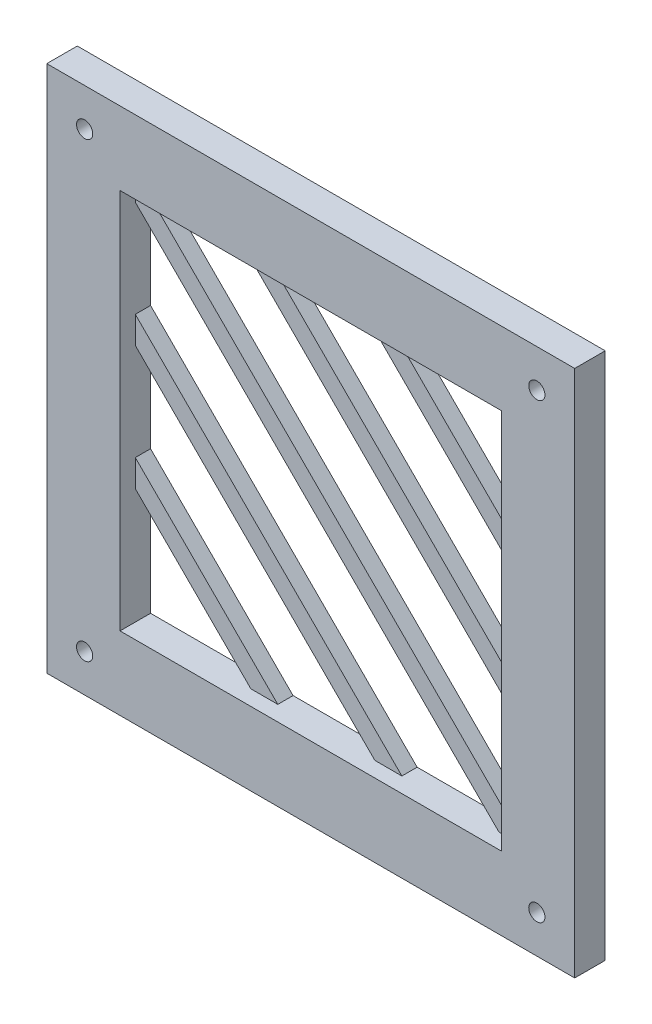
ISO-10303-21;
HEADER;
FILE_DESCRIPTION(('STEP AP214'),'2;1');
FILE_NAME('part.step','',(''),(''),'','','');
FILE_SCHEMA(('AUTOMOTIVE_DESIGN { 1 0 10303 214 1 1 1 1 }'));
ENDSEC;
DATA;
#1=APPLICATION_CONTEXT('core data for automotive mechanical design processes');
#2=APPLICATION_PROTOCOL_DEFINITION('international standard','automotive_design',2000,#1);
#3=PRODUCT_CONTEXT('',#1,'mechanical');
#4=PRODUCT('Part','Part','',(#3));
#5=PRODUCT_RELATED_PRODUCT_CATEGORY('part','',(#4));
#6=PRODUCT_DEFINITION_FORMATION('','',#4);
#7=PRODUCT_DEFINITION_CONTEXT('part definition',#1,'design');
#8=PRODUCT_DEFINITION('design','',#6,#7);
#9=PRODUCT_DEFINITION_SHAPE('','',#8);
#10=(LENGTH_UNIT() NAMED_UNIT(*) SI_UNIT(.MILLI.,.METRE.));
#11=(NAMED_UNIT(*) PLANE_ANGLE_UNIT() SI_UNIT($,.RADIAN.));
#12=(NAMED_UNIT(*) SI_UNIT($,.STERADIAN.) SOLID_ANGLE_UNIT());
#13=UNCERTAINTY_MEASURE_WITH_UNIT(LENGTH_MEASURE(1.E-05),#10,'distance_accuracy_value','');
#14=(GEOMETRIC_REPRESENTATION_CONTEXT(3) GLOBAL_UNCERTAINTY_ASSIGNED_CONTEXT((#13)) GLOBAL_UNIT_ASSIGNED_CONTEXT((#10,
#11,#12)) REPRESENTATION_CONTEXT('',''));
#15=CARTESIAN_POINT('',(0.,0.,0.));
#16=DIRECTION('',(0.,0.,1.));
#17=DIRECTION('',(1.,0.,0.));
#18=AXIS2_PLACEMENT_3D('',#15,#16,#17);
#19=CARTESIAN_POINT('',(0.,0.,8.));
#20=DIRECTION('',(0.,0.,-1.));
#21=DIRECTION('',(-1.,0.,0.));
#22=AXIS2_PLACEMENT_3D('',#19,#20,#21);
#23=PLANE('',#22);
#24=DIRECTION('',(0.,1.,0.));
#25=VECTOR('',#24,1.);
#26=CARTESIAN_POINT('',(50.,-50.,8.));
#27=LINE('',#26,#25);
#28=CARTESIAN_POINT('',(50.,-50.,8.));
#29=VERTEX_POINT('',#28);
#30=CARTESIAN_POINT('',(50.,50.,8.));
#31=VERTEX_POINT('',#30);
#32=EDGE_CURVE('E254',#29,#31,#27,.T.);
#33=ORIENTED_EDGE('',*,*,#32,.F.);
#34=DIRECTION('',(1.,0.,0.));
#35=VECTOR('',#34,1.);
#36=CARTESIAN_POINT('',(-50.,-50.,8.));
#37=LINE('',#36,#35);
#38=CARTESIAN_POINT('',(-50.,-50.,8.));
#39=VERTEX_POINT('',#38);
#40=EDGE_CURVE('E395',#39,#29,#37,.T.);
#41=ORIENTED_EDGE('',*,*,#40,.F.);
#42=DIRECTION('',(0.,-1.,0.));
#43=VECTOR('',#42,1.);
#44=CARTESIAN_POINT('',(-50.,-50.,8.));
#45=LINE('',#44,#43);
#46=CARTESIAN_POINT('',(-50.,50.,8.));
#47=VERTEX_POINT('',#46);
#48=EDGE_CURVE('E391',#47,#39,#45,.T.);
#49=ORIENTED_EDGE('',*,*,#48,.F.);
#50=DIRECTION('',(-1.,0.,0.));
#51=VECTOR('',#50,1.);
#52=CARTESIAN_POINT('',(-50.,50.,8.));
#53=LINE('',#52,#51);
#54=EDGE_CURVE('E388',#31,#47,#53,.T.);
#55=ORIENTED_EDGE('',*,*,#54,.F.);
#56=EDGE_LOOP('',(#33,#41,#49,#55));
#57=FACE_BOUND('',#56,.T.);
#58=DIRECTION('',(0.,1.,0.));
#59=VECTOR('',#58,1.);
#60=CARTESIAN_POINT('',(69.21,-69.21,8.));
#61=LINE('',#60,#59);
#62=CARTESIAN_POINT('',(69.21,-69.21,8.));
#63=VERTEX_POINT('',#62);
#64=CARTESIAN_POINT('',(69.21,69.21,8.));
#65=VERTEX_POINT('',#64);
#66=EDGE_CURVE('E434',#63,#65,#61,.T.);
#67=ORIENTED_EDGE('',*,*,#66,.T.);
#68=DIRECTION('',(-1.,0.,0.));
#69=VECTOR('',#68,1.);
#70=CARTESIAN_POINT('',(-69.21,69.21,8.));
#71=LINE('',#70,#69);
#72=CARTESIAN_POINT('',(-69.21,69.21,8.));
#73=VERTEX_POINT('',#72);
#74=EDGE_CURVE('E438',#65,#73,#71,.T.);
#75=ORIENTED_EDGE('',*,*,#74,.T.);
#76=DIRECTION('',(0.,-1.,0.));
#77=VECTOR('',#76,1.);
#78=CARTESIAN_POINT('',(-69.21,-69.21,8.));
#79=LINE('',#78,#77);
#80=CARTESIAN_POINT('',(-69.21,-69.21,8.));
#81=VERTEX_POINT('',#80);
#82=EDGE_CURVE('E442',#73,#81,#79,.T.);
#83=ORIENTED_EDGE('',*,*,#82,.T.);
#84=DIRECTION('',(1.,0.,0.));
#85=VECTOR('',#84,1.);
#86=CARTESIAN_POINT('',(-69.21,-69.21,8.));
#87=LINE('',#86,#85);
#88=EDGE_CURVE('E445',#81,#63,#87,.T.);
#89=ORIENTED_EDGE('',*,*,#88,.T.);
#90=EDGE_LOOP('',(#67,#75,#83,#89));
#91=FACE_BOUND('',#90,.T.);
#92=CARTESIAN_POINT('',(-59.285,59.285,8.));
#93=DIRECTION('',(0.,0.,1.));
#94=DIRECTION('',(1.,0.,0.));
#95=AXIS2_PLACEMENT_3D('',#92,#93,#94);
#96=CIRCLE('',#95,2.125);
#97=CARTESIAN_POINT('',(-57.16,59.285,8.));
#98=VERTEX_POINT('',#97);
#99=EDGE_CURVE('E426',#98,#98,#96,.T.);
#100=ORIENTED_EDGE('',*,*,#99,.F.);
#101=EDGE_LOOP('',(#100));
#102=FACE_BOUND('',#101,.T.);
#103=CARTESIAN_POINT('',(59.285,-59.285,8.));
#104=DIRECTION('',(0.,0.,1.));
#105=DIRECTION('',(-1.,0.,0.));
#106=AXIS2_PLACEMENT_3D('',#103,#104,#105);
#107=CIRCLE('',#106,2.12500000000002);
#108=CARTESIAN_POINT('',(57.1599999999999,-59.285,8.));
#109=VERTEX_POINT('',#108);
#110=EDGE_CURVE('E418',#109,#109,#107,.T.);
#111=ORIENTED_EDGE('',*,*,#110,.F.);
#112=EDGE_LOOP('',(#111));
#113=FACE_BOUND('',#112,.T.);
#114=CARTESIAN_POINT('',(59.285,59.285,8.));
#115=DIRECTION('',(0.,0.,1.));
#116=DIRECTION('',(1.,0.,0.));
#117=AXIS2_PLACEMENT_3D('',#114,#115,#116);
#118=CIRCLE('',#117,2.12500000000002);
#119=CARTESIAN_POINT('',(61.41,59.285,8.));
#120=VERTEX_POINT('',#119);
#121=EDGE_CURVE('E410',#120,#120,#118,.T.);
#122=ORIENTED_EDGE('',*,*,#121,.F.);
#123=EDGE_LOOP('',(#122));
#124=FACE_BOUND('',#123,.T.);
#125=CARTESIAN_POINT('',(-59.285,-59.285,8.));
#126=DIRECTION('',(0.,0.,1.));
#127=DIRECTION('',(-1.,0.,0.));
#128=AXIS2_PLACEMENT_3D('',#125,#126,#127);
#129=CIRCLE('',#128,2.125);
#130=CARTESIAN_POINT('',(-61.41,-59.285,8.));
#131=VERTEX_POINT('',#130);
#132=EDGE_CURVE('E402',#131,#131,#129,.T.);
#133=ORIENTED_EDGE('',*,*,#132,.F.);
#134=EDGE_LOOP('',(#133));
#135=FACE_BOUND('',#134,.T.);
#136=ADVANCED_FACE('F45',(#57,#91,#102,#113,#124,#135),#23,.F.);
#137=CARTESIAN_POINT('',(0.,0.,0.));
#138=DIRECTION('',(0.,0.,-1.));
#139=DIRECTION('',(-1.,0.,0.));
#140=AXIS2_PLACEMENT_3D('',#137,#138,#139);
#141=PLANE('',#140);
#142=DIRECTION('',(0.,-1.,0.));
#143=VECTOR('',#142,1.);
#144=CARTESIAN_POINT('',(-50.,-50.,0.));
#145=LINE('',#144,#143);
#146=CARTESIAN_POINT('',(-50.,12.8212844498098,0.));
#147=VERTEX_POINT('',#146);
#148=CARTESIAN_POINT('',(-50.,-12.6345596729059,0.));
#149=VERTEX_POINT('',#148);
#150=EDGE_CURVE('E379',#147,#149,#145,.T.);
#151=ORIENTED_EDGE('',*,*,#150,.T.);
#152=DIRECTION('',(0.707106781186547,-0.707106781186548,0.));
#153=VECTOR('',#152,1.);
#154=CARTESIAN_POINT('',(-100.528694050015,37.8941343771094,0.));
#155=LINE('',#154,#153);
#156=CARTESIAN_POINT('',(-12.6345596729059,-50.,0.));
#157=VERTEX_POINT('',#156);
#158=EDGE_CURVE('E825',#149,#157,#155,.T.);
#159=ORIENTED_EDGE('',*,*,#158,.T.);
#160=DIRECTION('',(1.,0.,0.));
#161=VECTOR('',#160,1.);
#162=CARTESIAN_POINT('',(-50.,-50.,0.));
#163=LINE('',#162,#161);
#164=CARTESIAN_POINT('',(12.8212844498098,-50.,0.));
#165=VERTEX_POINT('',#164);
#166=EDGE_CURVE('E385',#157,#165,#163,.T.);
#167=ORIENTED_EDGE('',*,*,#166,.T.);
#168=DIRECTION('',(0.707106781186547,-0.707106781186548,0.));
#169=VECTOR('',#168,1.);
#170=CARTESIAN_POINT('',(-87.8007719886575,50.6220564384672,0.));
#171=LINE('',#170,#169);
#172=EDGE_CURVE('E849',#147,#165,#171,.T.);
#173=ORIENTED_EDGE('',*,*,#172,.F.);
#174=EDGE_LOOP('',(#151,#159,#167,#173));
#175=FACE_BOUND('',#174,.T.);
#176=DIRECTION('',(0.707106781186547,-0.707106781186548,0.));
#177=VECTOR('',#176,1.);
#178=CARTESIAN_POINT('',(-84.2652380827247,54.1575903444,0.));
#179=LINE('',#178,#177);
#180=CARTESIAN_POINT('',(-50.,19.8923522616752,0.));
#181=VERTEX_POINT('',#180);
#182=CARTESIAN_POINT('',(19.8923522616752,-50.,0.));
#183=VERTEX_POINT('',#182);
#184=EDGE_CURVE('E846',#181,#183,#179,.T.);
#185=ORIENTED_EDGE('',*,*,#184,.T.);
#186=CARTESIAN_POINT('',(45.3481963843909,-50.,0.));
#187=VERTEX_POINT('',#186);
#188=EDGE_CURVE('E378',#183,#187,#163,.T.);
#189=ORIENTED_EDGE('',*,*,#188,.T.);
#190=DIRECTION('',(0.707106781186547,-0.707106781186548,0.));
#191=VECTOR('',#190,1.);
#192=CARTESIAN_POINT('',(-71.5373160213669,66.8855124057578,0.));
#193=LINE('',#192,#191);
#194=CARTESIAN_POINT('',(-50.,45.3481963843909,0.));
#195=VERTEX_POINT('',#194);
#196=EDGE_CURVE('E321',#195,#187,#193,.T.);
#197=ORIENTED_EDGE('',*,*,#196,.F.);
#198=EDGE_CURVE('E374',#195,#181,#145,.T.);
#199=ORIENTED_EDGE('',*,*,#198,.T.);
#200=EDGE_LOOP('',(#185,#189,#197,#199));
#201=FACE_BOUND('',#200,.T.);
#202=DIRECTION('',(-1.,0.,0.));
#203=VECTOR('',#202,1.);
#204=CARTESIAN_POINT('',(-50.,50.,0.));
#205=LINE('',#204,#203);
#206=CARTESIAN_POINT('',(-22.1248916810279,50.,0.));
#207=VERTEX_POINT('',#206);
#208=CARTESIAN_POINT('',(-47.5807358037436,50.,0.));
#209=VERTEX_POINT('',#208);
#210=EDGE_CURVE('E366',#207,#209,#205,.T.);
#211=ORIENTED_EDGE('',*,*,#210,.T.);
#212=DIRECTION('',(0.707106781186547,-0.707106781186548,0.));
#213=VECTOR('',#212,1.);
#214=CARTESIAN_POINT('',(-68.0017821154341,70.4210463116906,0.));
#215=LINE('',#214,#213);
#216=CARTESIAN_POINT('',(50.,-47.5807358037436,0.));
#217=VERTEX_POINT('',#216);
#218=EDGE_CURVE('E318',#209,#217,#215,.T.);
#219=ORIENTED_EDGE('',*,*,#218,.T.);
#220=DIRECTION('',(0.,1.,0.));
#221=VECTOR('',#220,1.);
#222=CARTESIAN_POINT('',(50.,-50.,0.));
#223=LINE('',#222,#221);
#224=CARTESIAN_POINT('',(50.,-22.1248916810279,0.));
#225=VERTEX_POINT('',#224);
#226=EDGE_CURVE('E362',#217,#225,#223,.T.);
#227=ORIENTED_EDGE('',*,*,#226,.T.);
#228=DIRECTION('',(0.707106781186547,-0.707106781186547,0.));
#229=VECTOR('',#228,1.);
#230=CARTESIAN_POINT('',(-55.2738600540763,83.1489683730484,0.));
#231=LINE('',#230,#229);
#232=EDGE_CURVE('E316',#207,#225,#231,.T.);
#233=ORIENTED_EDGE('',*,*,#232,.F.);
#234=EDGE_LOOP('',(#211,#219,#227,#233));
#235=FACE_BOUND('',#234,.T.);
#236=CARTESIAN_POINT('',(10.4020202535533,50.,0.));
#237=VERTEX_POINT('',#236);
#238=CARTESIAN_POINT('',(-15.0538238691624,50.,0.));
#239=VERTEX_POINT('',#238);
#240=EDGE_CURVE('E373',#237,#239,#205,.T.);
#241=ORIENTED_EDGE('',*,*,#240,.T.);
#242=DIRECTION('',(0.707106781186547,-0.707106781186547,0.));
#243=VECTOR('',#242,1.);
#244=CARTESIAN_POINT('',(-51.7383261481435,86.6845022789812,0.));
#245=LINE('',#244,#243);
#246=CARTESIAN_POINT('',(50.,-15.0538238691624,0.));
#247=VERTEX_POINT('',#246);
#248=EDGE_CURVE('E311',#239,#247,#245,.T.);
#249=ORIENTED_EDGE('',*,*,#248,.T.);
#250=CARTESIAN_POINT('',(50.,10.4020202535533,0.));
#251=VERTEX_POINT('',#250);
#252=EDGE_CURVE('E309',#247,#251,#223,.T.);
#253=ORIENTED_EDGE('',*,*,#252,.T.);
#254=DIRECTION('',(0.707106781186547,-0.707106781186547,0.));
#255=VECTOR('',#254,1.);
#256=CARTESIAN_POINT('',(-39.0104040867857,99.412424340339,0.));
#257=LINE('',#256,#255);
#258=EDGE_CURVE('E339',#237,#251,#257,.T.);
#259=ORIENTED_EDGE('',*,*,#258,.F.);
#260=EDGE_LOOP('',(#241,#249,#253,#259));
#261=FACE_BOUND('',#260,.T.);
#262=DIRECTION('',(0.707106781186547,-0.707106781186547,0.));
#263=VECTOR('',#262,1.);
#264=CARTESIAN_POINT('',(-35.4748701808529,102.947958246272,0.));
#265=LINE('',#264,#263);
#266=CARTESIAN_POINT('',(17.4730880654188,50.,0.));
#267=VERTEX_POINT('',#266);
#268=CARTESIAN_POINT('',(50.,17.4730880654188,0.));
#269=VERTEX_POINT('',#268);
#270=EDGE_CURVE('E336',#267,#269,#265,.T.);
#271=ORIENTED_EDGE('',*,*,#270,.T.);
#272=CARTESIAN_POINT('',(50.,42.9289321881345,0.));
#273=VERTEX_POINT('',#272);
#274=EDGE_CURVE('E367',#269,#273,#223,.T.);
#275=ORIENTED_EDGE('',*,*,#274,.T.);
#276=DIRECTION('',(0.707106781186547,-0.707106781186547,0.));
#277=VECTOR('',#276,1.);
#278=CARTESIAN_POINT('',(-22.7469481194951,115.67588030763,0.));
#279=LINE('',#278,#277);
#280=CARTESIAN_POINT('',(42.9289321881345,50.,0.));
#281=VERTEX_POINT('',#280);
#282=EDGE_CURVE('E356',#281,#273,#279,.T.);
#283=ORIENTED_EDGE('',*,*,#282,.F.);
#284=EDGE_CURVE('E368',#281,#267,#205,.T.);
#285=ORIENTED_EDGE('',*,*,#284,.T.);
#286=EDGE_LOOP('',(#271,#275,#283,#285));
#287=FACE_BOUND('',#286,.T.);
#288=CARTESIAN_POINT('',(-50.,-50.,0.));
#289=VERTEX_POINT('',#288);
#290=CARTESIAN_POINT('',(-19.7056274847714,-50.,0.));
#291=VERTEX_POINT('',#290);
#292=EDGE_CURVE('E380',#289,#291,#163,.T.);
#293=ORIENTED_EDGE('',*,*,#292,.T.);
#294=DIRECTION('',(0.707106781186547,-0.707106781186548,0.));
#295=VECTOR('',#294,1.);
#296=CARTESIAN_POINT('',(-104.064227955948,34.3586004711767,0.));
#297=LINE('',#296,#295);
#298=CARTESIAN_POINT('',(-50.,-19.7056274847714,0.));
#299=VERTEX_POINT('',#298);
#300=EDGE_CURVE('E827',#299,#291,#297,.T.);
#301=ORIENTED_EDGE('',*,*,#300,.F.);
#302=EDGE_CURVE('E372',#299,#289,#145,.T.);
#303=ORIENTED_EDGE('',*,*,#302,.T.);
#304=EDGE_LOOP('',(#293,#301,#303));
#305=FACE_BOUND('',#304,.T.);
#306=CARTESIAN_POINT('',(59.285,59.285,0.));
#307=DIRECTION('',(0.,0.,1.));
#308=DIRECTION('',(1.,0.,0.));
#309=AXIS2_PLACEMENT_3D('',#306,#307,#308);
#310=CIRCLE('',#309,2.12500000000002);
#311=CARTESIAN_POINT('',(61.41,59.285,0.));
#312=VERTEX_POINT('',#311);
#313=EDGE_CURVE('E406',#312,#312,#310,.T.);
#314=ORIENTED_EDGE('',*,*,#313,.T.);
#315=EDGE_LOOP('',(#314));
#316=FACE_BOUND('',#315,.T.);
#317=CARTESIAN_POINT('',(-59.285,59.285,0.));
#318=DIRECTION('',(0.,0.,1.));
#319=DIRECTION('',(1.,0.,0.));
#320=AXIS2_PLACEMENT_3D('',#317,#318,#319);
#321=CIRCLE('',#320,2.125);
#322=CARTESIAN_POINT('',(-57.16,59.285,0.));
#323=VERTEX_POINT('',#322);
#324=EDGE_CURVE('E422',#323,#323,#321,.T.);
#325=ORIENTED_EDGE('',*,*,#324,.T.);
#326=EDGE_LOOP('',(#325));
#327=FACE_BOUND('',#326,.T.);
#328=DIRECTION('',(0.,1.,0.));
#329=VECTOR('',#328,1.);
#330=CARTESIAN_POINT('',(69.21,-69.21,0.));
#331=LINE('',#330,#329);
#332=CARTESIAN_POINT('',(69.21,-69.21,0.));
#333=VERTEX_POINT('',#332);
#334=CARTESIAN_POINT('',(69.21,69.21,0.));
#335=VERTEX_POINT('',#334);
#336=EDGE_CURVE('E430',#333,#335,#331,.T.);
#337=ORIENTED_EDGE('',*,*,#336,.F.);
#338=DIRECTION('',(1.,0.,0.));
#339=VECTOR('',#338,1.);
#340=CARTESIAN_POINT('',(-69.21,-69.21,0.));
#341=LINE('',#340,#339);
#342=CARTESIAN_POINT('',(-69.21,-69.21,0.));
#343=VERTEX_POINT('',#342);
#344=EDGE_CURVE('E439',#343,#333,#341,.T.);
#345=ORIENTED_EDGE('',*,*,#344,.F.);
#346=DIRECTION('',(0.,-1.,0.));
#347=VECTOR('',#346,1.);
#348=CARTESIAN_POINT('',(-69.21,-69.21,0.));
#349=LINE('',#348,#347);
#350=CARTESIAN_POINT('',(-69.21,69.21,0.));
#351=VERTEX_POINT('',#350);
#352=EDGE_CURVE('E455',#351,#343,#349,.T.);
#353=ORIENTED_EDGE('',*,*,#352,.F.);
#354=DIRECTION('',(-1.,0.,0.));
#355=VECTOR('',#354,1.);
#356=CARTESIAN_POINT('',(-69.21,69.21,0.));
#357=LINE('',#356,#355);
#358=EDGE_CURVE('E452',#335,#351,#357,.T.);
#359=ORIENTED_EDGE('',*,*,#358,.F.);
#360=EDGE_LOOP('',(#337,#345,#353,#359));
#361=FACE_BOUND('',#360,.T.);
#362=CARTESIAN_POINT('',(59.285,-59.285,0.));
#363=DIRECTION('',(0.,0.,1.));
#364=DIRECTION('',(-1.,0.,0.));
#365=AXIS2_PLACEMENT_3D('',#362,#363,#364);
#366=CIRCLE('',#365,2.12500000000002);
#367=CARTESIAN_POINT('',(57.1599999999999,-59.285,0.));
#368=VERTEX_POINT('',#367);
#369=EDGE_CURVE('E414',#368,#368,#366,.T.);
#370=ORIENTED_EDGE('',*,*,#369,.T.);
#371=EDGE_LOOP('',(#370));
#372=FACE_BOUND('',#371,.T.);
#373=CARTESIAN_POINT('',(-59.285,-59.285,0.));
#374=DIRECTION('',(0.,0.,1.));
#375=DIRECTION('',(-1.,0.,0.));
#376=AXIS2_PLACEMENT_3D('',#373,#374,#375);
#377=CIRCLE('',#376,2.125);
#378=CARTESIAN_POINT('',(-61.41,-59.285,0.));
#379=VERTEX_POINT('',#378);
#380=EDGE_CURVE('E401',#379,#379,#377,.T.);
#381=ORIENTED_EDGE('',*,*,#380,.T.);
#382=EDGE_LOOP('',(#381));
#383=FACE_BOUND('',#382,.T.);
#384=ADVANCED_FACE('F482',(#175,#201,#235,#261,#287,#305,#316,#327,#361,#372,#383),#141,.T.);
#385=CARTESIAN_POINT('',(69.21,-69.21,8.));
#386=DIRECTION('',(-1.,0.,0.));
#387=DIRECTION('',(0.,0.,1.));
#388=AXIS2_PLACEMENT_3D('',#385,#386,#387);
#389=PLANE('',#388);
#390=ORIENTED_EDGE('',*,*,#336,.T.);
#391=DIRECTION('',(0.,0.,-1.));
#392=VECTOR('',#391,1.);
#393=CARTESIAN_POINT('',(69.21,69.21,8.));
#394=LINE('',#393,#392);
#395=EDGE_CURVE('E54',#65,#335,#394,.T.);
#396=ORIENTED_EDGE('',*,*,#395,.F.);
#397=ORIENTED_EDGE('',*,*,#66,.F.);
#398=DIRECTION('',(0.,0.,-1.));
#399=VECTOR('',#398,1.);
#400=CARTESIAN_POINT('',(69.21,-69.21,8.));
#401=LINE('',#400,#399);
#402=EDGE_CURVE('E448',#63,#333,#401,.T.);
#403=ORIENTED_EDGE('',*,*,#402,.T.);
#404=EDGE_LOOP('',(#390,#396,#397,#403));
#405=FACE_BOUND('',#404,.T.);
#406=ADVANCED_FACE('F47',(#405),#389,.F.);
#407=CARTESIAN_POINT('',(-69.21,69.21,8.));
#408=DIRECTION('',(0.,-1.,0.));
#409=DIRECTION('',(0.,0.,-1.));
#410=AXIS2_PLACEMENT_3D('',#407,#408,#409);
#411=PLANE('',#410);
#412=ORIENTED_EDGE('',*,*,#358,.T.);
#413=DIRECTION('',(0.,0.,-1.));
#414=VECTOR('',#413,1.);
#415=CARTESIAN_POINT('',(-69.21,69.21,8.));
#416=LINE('',#415,#414);
#417=EDGE_CURVE('E467',#73,#351,#416,.T.);
#418=ORIENTED_EDGE('',*,*,#417,.F.);
#419=ORIENTED_EDGE('',*,*,#74,.F.);
#420=ORIENTED_EDGE('',*,*,#395,.T.);
#421=EDGE_LOOP('',(#412,#418,#419,#420));
#422=FACE_BOUND('',#421,.T.);
#423=ADVANCED_FACE('F474',(#422),#411,.F.);
#424=CARTESIAN_POINT('',(-69.21,-69.21,8.));
#425=DIRECTION('',(1.,0.,0.));
#426=DIRECTION('',(0.,0.,-1.));
#427=AXIS2_PLACEMENT_3D('',#424,#425,#426);
#428=PLANE('',#427);
#429=ORIENTED_EDGE('',*,*,#352,.T.);
#430=DIRECTION('',(0.,0.,-1.));
#431=VECTOR('',#430,1.);
#432=CARTESIAN_POINT('',(-69.21,-69.21,8.));
#433=LINE('',#432,#431);
#434=EDGE_CURVE('E463',#81,#343,#433,.T.);
#435=ORIENTED_EDGE('',*,*,#434,.F.);
#436=ORIENTED_EDGE('',*,*,#82,.F.);
#437=ORIENTED_EDGE('',*,*,#417,.T.);
#438=EDGE_LOOP('',(#429,#435,#436,#437));
#439=FACE_BOUND('',#438,.T.);
#440=ADVANCED_FACE('F487',(#439),#428,.F.);
#441=CARTESIAN_POINT('',(-69.21,-69.21,8.));
#442=DIRECTION('',(0.,1.,0.));
#443=DIRECTION('',(0.,0.,1.));
#444=AXIS2_PLACEMENT_3D('',#441,#442,#443);
#445=PLANE('',#444);
#446=ORIENTED_EDGE('',*,*,#344,.T.);
#447=ORIENTED_EDGE('',*,*,#402,.F.);
#448=ORIENTED_EDGE('',*,*,#88,.F.);
#449=ORIENTED_EDGE('',*,*,#434,.T.);
#450=EDGE_LOOP('',(#446,#447,#448,#449));
#451=FACE_BOUND('',#450,.T.);
#452=ADVANCED_FACE('F491',(#451),#445,.F.);
#453=CARTESIAN_POINT('',(-59.285,59.285,8.));
#454=DIRECTION('',(0.,0.,-1.));
#455=DIRECTION('',(-1.,0.,0.));
#456=AXIS2_PLACEMENT_3D('',#453,#454,#455);
#457=CYLINDRICAL_SURFACE('',#456,2.125);
#458=ORIENTED_EDGE('',*,*,#99,.T.);
#459=EDGE_LOOP('',(#458));
#460=FACE_BOUND('',#459,.T.);
#461=ORIENTED_EDGE('',*,*,#324,.F.);
#462=EDGE_LOOP('',(#461));
#463=FACE_BOUND('',#462,.T.);
#464=ADVANCED_FACE('F524',(#460,#463),#457,.F.);
#465=CARTESIAN_POINT('',(59.285,-59.285,8.));
#466=DIRECTION('',(0.,0.,-1.));
#467=DIRECTION('',(-1.,0.,0.));
#468=AXIS2_PLACEMENT_3D('',#465,#466,#467);
#469=CYLINDRICAL_SURFACE('',#468,2.12500000000002);
#470=ORIENTED_EDGE('',*,*,#110,.T.);
#471=EDGE_LOOP('',(#470));
#472=FACE_BOUND('',#471,.T.);
#473=ORIENTED_EDGE('',*,*,#369,.F.);
#474=EDGE_LOOP('',(#473));
#475=FACE_BOUND('',#474,.T.);
#476=ADVANCED_FACE('F548',(#472,#475),#469,.F.);
#477=CARTESIAN_POINT('',(59.285,59.285,8.));
#478=DIRECTION('',(0.,0.,-1.));
#479=DIRECTION('',(-1.,0.,0.));
#480=AXIS2_PLACEMENT_3D('',#477,#478,#479);
#481=CYLINDRICAL_SURFACE('',#480,2.12500000000002);
#482=ORIENTED_EDGE('',*,*,#121,.T.);
#483=EDGE_LOOP('',(#482));
#484=FACE_BOUND('',#483,.T.);
#485=ORIENTED_EDGE('',*,*,#313,.F.);
#486=EDGE_LOOP('',(#485));
#487=FACE_BOUND('',#486,.T.);
#488=ADVANCED_FACE('F508',(#484,#487),#481,.F.);
#489=CARTESIAN_POINT('',(-59.285,-59.285,8.));
#490=DIRECTION('',(0.,0.,-1.));
#491=DIRECTION('',(-1.,0.,0.));
#492=AXIS2_PLACEMENT_3D('',#489,#490,#491);
#493=CYLINDRICAL_SURFACE('',#492,2.125);
#494=ORIENTED_EDGE('',*,*,#132,.T.);
#495=EDGE_LOOP('',(#494));
#496=FACE_BOUND('',#495,.T.);
#497=ORIENTED_EDGE('',*,*,#380,.F.);
#498=EDGE_LOOP('',(#497));
#499=FACE_BOUND('',#498,.T.);
#500=ADVANCED_FACE('F505',(#496,#499),#493,.F.);
#501=CARTESIAN_POINT('',(50.,-50.,0.));
#502=DIRECTION('',(1.,0.,0.));
#503=DIRECTION('',(0.,0.,-1.));
#504=AXIS2_PLACEMENT_3D('',#501,#502,#503);
#505=PLANE('',#504);
#506=DIRECTION('',(0.,0.,1.));
#507=VECTOR('',#506,1.);
#508=CARTESIAN_POINT('',(50.,17.4730880654188,8.00000000000003));
#509=LINE('',#508,#507);
#510=CARTESIAN_POINT('',(50.,17.4730880654188,4.));
#511=VERTEX_POINT('',#510);
#512=EDGE_CURVE('E333',#269,#511,#509,.T.);
#513=ORIENTED_EDGE('',*,*,#512,.T.);
#514=DIRECTION('',(0.,1.,0.));
#515=VECTOR('',#514,1.);
#516=CARTESIAN_POINT('',(50.,-50.,4.));
#517=LINE('',#516,#515);
#518=CARTESIAN_POINT('',(50.,10.4020202535533,4.));
#519=VERTEX_POINT('',#518);
#520=EDGE_CURVE('E69',#519,#511,#517,.T.);
#521=ORIENTED_EDGE('',*,*,#520,.F.);
#522=DIRECTION('',(0.,0.,-1.));
#523=VECTOR('',#522,1.);
#524=CARTESIAN_POINT('',(50.,10.4020202535533,8.00000000000006));
#525=LINE('',#524,#523);
#526=EDGE_CURVE('E332',#519,#251,#525,.T.);
#527=ORIENTED_EDGE('',*,*,#526,.T.);
#528=ORIENTED_EDGE('',*,*,#252,.F.);
#529=DIRECTION('',(0.,0.,1.));
#530=VECTOR('',#529,1.);
#531=CARTESIAN_POINT('',(50.,-15.0538238691624,8.00000000000002));
#532=LINE('',#531,#530);
#533=CARTESIAN_POINT('',(50.,-15.0538238691624,4.));
#534=VERTEX_POINT('',#533);
#535=EDGE_CURVE('E300',#247,#534,#532,.T.);
#536=ORIENTED_EDGE('',*,*,#535,.T.);
#537=CARTESIAN_POINT('',(50.,-22.1248916810279,4.));
#538=VERTEX_POINT('',#537);
#539=EDGE_CURVE('E282',#538,#534,#517,.T.);
#540=ORIENTED_EDGE('',*,*,#539,.F.);
#541=DIRECTION('',(0.,0.,-1.));
#542=VECTOR('',#541,1.);
#543=CARTESIAN_POINT('',(50.,-22.1248916810279,8.00000000000005));
#544=LINE('',#543,#542);
#545=EDGE_CURVE('E312',#538,#225,#544,.T.);
#546=ORIENTED_EDGE('',*,*,#545,.T.);
#547=ORIENTED_EDGE('',*,*,#226,.F.);
#548=DIRECTION('',(0.,0.,1.));
#549=VECTOR('',#548,1.);
#550=CARTESIAN_POINT('',(50.,-47.5807358037436,8.));
#551=LINE('',#550,#549);
#552=CARTESIAN_POINT('',(50.,-47.5807358037436,4.));
#553=VERTEX_POINT('',#552);
#554=EDGE_CURVE('E863',#217,#553,#551,.T.);
#555=ORIENTED_EDGE('',*,*,#554,.T.);
#556=CARTESIAN_POINT('',(50.,-50.,4.));
#557=VERTEX_POINT('',#556);
#558=EDGE_CURVE('E248',#557,#553,#517,.T.);
#559=ORIENTED_EDGE('',*,*,#558,.F.);
#560=DIRECTION('',(0.,0.,1.));
#561=VECTOR('',#560,1.);
#562=CARTESIAN_POINT('',(50.,-50.,4.));
#563=LINE('',#562,#561);
#564=EDGE_CURVE('E942',#557,#29,#563,.T.);
#565=ORIENTED_EDGE('',*,*,#564,.T.);
#566=ORIENTED_EDGE('',*,*,#32,.T.);
#567=DIRECTION('',(0.,0.,1.));
#568=VECTOR('',#567,1.);
#569=CARTESIAN_POINT('',(50.,50.,4.));
#570=LINE('',#569,#568);
#571=CARTESIAN_POINT('',(50.,50.,4.));
#572=VERTEX_POINT('',#571);
#573=EDGE_CURVE('E250',#572,#31,#570,.T.);
#574=ORIENTED_EDGE('',*,*,#573,.F.);
#575=CARTESIAN_POINT('',(50.,42.9289321881345,4.));
#576=VERTEX_POINT('',#575);
#577=EDGE_CURVE('E240',#576,#572,#517,.T.);
#578=ORIENTED_EDGE('',*,*,#577,.F.);
#579=DIRECTION('',(0.,0.,-1.));
#580=VECTOR('',#579,1.);
#581=CARTESIAN_POINT('',(50.,42.9289321881345,8.00000000000008));
#582=LINE('',#581,#580);
#583=EDGE_CURVE('E353',#576,#273,#582,.T.);
#584=ORIENTED_EDGE('',*,*,#583,.T.);
#585=ORIENTED_EDGE('',*,*,#274,.F.);
#586=EDGE_LOOP('',(#513,#521,#527,#528,#536,#540,#546,#547,#555,#559,#565,#566,#574,#578,#584,#585));
#587=FACE_BOUND('',#586,.T.);
#588=ADVANCED_FACE('F252',(#587),#505,.F.);
#589=CARTESIAN_POINT('',(-50.,-50.,0.));
#590=DIRECTION('',(0.,-1.,0.));
#591=DIRECTION('',(0.,0.,-1.));
#592=AXIS2_PLACEMENT_3D('',#589,#590,#591);
#593=PLANE('',#592);
#594=DIRECTION('',(0.,0.,1.));
#595=VECTOR('',#594,1.);
#596=CARTESIAN_POINT('',(19.8923522616752,-50.,7.99999999999996));
#597=LINE('',#596,#595);
#598=CARTESIAN_POINT('',(19.8923522616752,-50.,4.));
#599=VERTEX_POINT('',#598);
#600=EDGE_CURVE('E842',#183,#599,#597,.T.);
#601=ORIENTED_EDGE('',*,*,#600,.T.);
#602=DIRECTION('',(1.,0.,0.));
#603=VECTOR('',#602,1.);
#604=CARTESIAN_POINT('',(-50.,-50.,4.));
#605=LINE('',#604,#603);
#606=CARTESIAN_POINT('',(12.8212844498097,-50.,4.));
#607=VERTEX_POINT('',#606);
#608=EDGE_CURVE('E922',#607,#599,#605,.T.);
#609=ORIENTED_EDGE('',*,*,#608,.F.);
#610=DIRECTION('',(0.,0.,-1.));
#611=VECTOR('',#610,1.);
#612=CARTESIAN_POINT('',(12.8212844498097,-50.,7.99999999999999));
#613=LINE('',#612,#611);
#614=EDGE_CURVE('E841',#607,#165,#613,.T.);
#615=ORIENTED_EDGE('',*,*,#614,.T.);
#616=ORIENTED_EDGE('',*,*,#166,.F.);
#617=DIRECTION('',(0.,0.,1.));
#618=VECTOR('',#617,1.);
#619=CARTESIAN_POINT('',(-12.6345596729059,-50.,7.99999999999994));
#620=LINE('',#619,#618);
#621=CARTESIAN_POINT('',(-12.6345596729059,-50.,4.));
#622=VERTEX_POINT('',#621);
#623=EDGE_CURVE('E819',#157,#622,#620,.T.);
#624=ORIENTED_EDGE('',*,*,#623,.T.);
#625=CARTESIAN_POINT('',(-19.7056274847714,-50.,4.));
#626=VERTEX_POINT('',#625);
#627=EDGE_CURVE('E259',#626,#622,#605,.T.);
#628=ORIENTED_EDGE('',*,*,#627,.F.);
#629=DIRECTION('',(0.,0.,-1.));
#630=VECTOR('',#629,1.);
#631=CARTESIAN_POINT('',(-19.7056274847714,-50.,7.99999999999997));
#632=LINE('',#631,#630);
#633=EDGE_CURVE('E816',#626,#291,#632,.T.);
#634=ORIENTED_EDGE('',*,*,#633,.T.);
#635=ORIENTED_EDGE('',*,*,#292,.F.);
#636=DIRECTION('',(0.,0.,1.));
#637=VECTOR('',#636,1.);
#638=CARTESIAN_POINT('',(-50.,-50.,0.));
#639=LINE('',#638,#637);
#640=EDGE_CURVE('E384',#289,#39,#639,.T.);
#641=ORIENTED_EDGE('',*,*,#640,.T.);
#642=ORIENTED_EDGE('',*,*,#40,.T.);
#643=ORIENTED_EDGE('',*,*,#564,.F.);
#644=CARTESIAN_POINT('',(45.3481963843909,-50.,4.));
#645=VERTEX_POINT('',#644);
#646=EDGE_CURVE('E924',#645,#557,#605,.T.);
#647=ORIENTED_EDGE('',*,*,#646,.F.);
#648=DIRECTION('',(0.,0.,-1.));
#649=VECTOR('',#648,1.);
#650=CARTESIAN_POINT('',(45.3481963843909,-50.,8.));
#651=LINE('',#650,#649);
#652=EDGE_CURVE('E864',#645,#187,#651,.T.);
#653=ORIENTED_EDGE('',*,*,#652,.T.);
#654=ORIENTED_EDGE('',*,*,#188,.F.);
#655=EDGE_LOOP('',(#601,#609,#615,#616,#624,#628,#634,#635,#641,#642,#643,#647,#653,#654));
#656=FACE_BOUND('',#655,.T.);
#657=ADVANCED_FACE('F581',(#656),#593,.F.);
#658=CARTESIAN_POINT('',(-50.,-50.,0.));
#659=DIRECTION('',(-1.,0.,0.));
#660=DIRECTION('',(0.,0.,1.));
#661=AXIS2_PLACEMENT_3D('',#658,#659,#660);
#662=PLANE('',#661);
#663=DIRECTION('',(0.,0.,-1.));
#664=VECTOR('',#663,1.);
#665=CARTESIAN_POINT('',(-50.,45.3481963843909,8.0000000000001));
#666=LINE('',#665,#664);
#667=CARTESIAN_POINT('',(-50.,45.3481963843909,4.));
#668=VERTEX_POINT('',#667);
#669=EDGE_CURVE('E867',#668,#195,#666,.T.);
#670=ORIENTED_EDGE('',*,*,#669,.F.);
#671=DIRECTION('',(0.,-1.,0.));
#672=VECTOR('',#671,1.);
#673=CARTESIAN_POINT('',(-50.,-50.,4.));
#674=LINE('',#673,#672);
#675=CARTESIAN_POINT('',(-50.,50.,4.));
#676=VERTEX_POINT('',#675);
#677=EDGE_CURVE('E274',#676,#668,#674,.T.);
#678=ORIENTED_EDGE('',*,*,#677,.F.);
#679=DIRECTION('',(0.,0.,1.));
#680=VECTOR('',#679,1.);
#681=CARTESIAN_POINT('',(-50.,50.,4.));
#682=LINE('',#681,#680);
#683=EDGE_CURVE('E258',#676,#47,#682,.T.);
#684=ORIENTED_EDGE('',*,*,#683,.T.);
#685=ORIENTED_EDGE('',*,*,#48,.T.);
#686=ORIENTED_EDGE('',*,*,#640,.F.);
#687=ORIENTED_EDGE('',*,*,#302,.F.);
#688=DIRECTION('',(0.,0.,-1.));
#689=VECTOR('',#688,1.);
#690=CARTESIAN_POINT('',(-50.,-19.7056274847714,8.00000000000007));
#691=LINE('',#690,#689);
#692=CARTESIAN_POINT('',(-50.,-19.7056274847714,4.));
#693=VERTEX_POINT('',#692);
#694=EDGE_CURVE('E838',#693,#299,#691,.T.);
#695=ORIENTED_EDGE('',*,*,#694,.F.);
#696=CARTESIAN_POINT('',(-50.,-12.6345596729059,4.));
#697=VERTEX_POINT('',#696);
#698=EDGE_CURVE('E266',#697,#693,#674,.T.);
#699=ORIENTED_EDGE('',*,*,#698,.F.);
#700=DIRECTION('',(0.,0.,1.));
#701=VECTOR('',#700,1.);
#702=CARTESIAN_POINT('',(-50.,-12.6345596729059,8.00000000000004));
#703=LINE('',#702,#701);
#704=EDGE_CURVE('E831',#149,#697,#703,.T.);
#705=ORIENTED_EDGE('',*,*,#704,.F.);
#706=ORIENTED_EDGE('',*,*,#150,.F.);
#707=DIRECTION('',(0.,0.,-1.));
#708=VECTOR('',#707,1.);
#709=CARTESIAN_POINT('',(-50.,12.8212844498098,8.00000000000008));
#710=LINE('',#709,#708);
#711=CARTESIAN_POINT('',(-50.,12.8212844498098,4.));
#712=VERTEX_POINT('',#711);
#713=EDGE_CURVE('E860',#712,#147,#710,.T.);
#714=ORIENTED_EDGE('',*,*,#713,.F.);
#715=CARTESIAN_POINT('',(-50.,19.8923522616752,4.));
#716=VERTEX_POINT('',#715);
#717=EDGE_CURVE('E272',#716,#712,#674,.T.);
#718=ORIENTED_EDGE('',*,*,#717,.F.);
#719=DIRECTION('',(0.,0.,1.));
#720=VECTOR('',#719,1.);
#721=CARTESIAN_POINT('',(-50.,19.8923522616752,8.00000000000005));
#722=LINE('',#721,#720);
#723=EDGE_CURVE('E853',#181,#716,#722,.T.);
#724=ORIENTED_EDGE('',*,*,#723,.F.);
#725=ORIENTED_EDGE('',*,*,#198,.F.);
#726=EDGE_LOOP('',(#670,#678,#684,#685,#686,#687,#695,#699,#705,#706,#714,#718,#724,#725));
#727=FACE_BOUND('',#726,.T.);
#728=ADVANCED_FACE('F593',(#727),#662,.F.);
#729=CARTESIAN_POINT('',(-50.,50.,0.));
#730=DIRECTION('',(0.,1.,0.));
#731=DIRECTION('',(0.,0.,1.));
#732=AXIS2_PLACEMENT_3D('',#729,#730,#731);
#733=PLANE('',#732);
#734=DIRECTION('',(0.,0.,-1.));
#735=VECTOR('',#734,1.);
#736=CARTESIAN_POINT('',(42.9289321881345,50.,8.00000000000017));
#737=LINE('',#736,#735);
#738=CARTESIAN_POINT('',(42.9289321881345,50.,4.));
#739=VERTEX_POINT('',#738);
#740=EDGE_CURVE('E264',#739,#281,#737,.T.);
#741=ORIENTED_EDGE('',*,*,#740,.F.);
#742=DIRECTION('',(-1.,0.,0.));
#743=VECTOR('',#742,1.);
#744=CARTESIAN_POINT('',(-50.,50.,4.));
#745=LINE('',#744,#743);
#746=EDGE_CURVE('E61',#572,#739,#745,.T.);
#747=ORIENTED_EDGE('',*,*,#746,.F.);
#748=ORIENTED_EDGE('',*,*,#573,.T.);
#749=ORIENTED_EDGE('',*,*,#54,.T.);
#750=ORIENTED_EDGE('',*,*,#683,.F.);
#751=CARTESIAN_POINT('',(-47.5807358037436,50.,4.));
#752=VERTEX_POINT('',#751);
#753=EDGE_CURVE('E269',#752,#676,#745,.T.);
#754=ORIENTED_EDGE('',*,*,#753,.F.);
#755=DIRECTION('',(0.,0.,1.));
#756=VECTOR('',#755,1.);
#757=CARTESIAN_POINT('',(-47.5807358037436,50.,8.0000000000001));
#758=LINE('',#757,#756);
#759=EDGE_CURVE('E873',#209,#752,#758,.T.);
#760=ORIENTED_EDGE('',*,*,#759,.F.);
#761=ORIENTED_EDGE('',*,*,#210,.F.);
#762=DIRECTION('',(0.,0.,-1.));
#763=VECTOR('',#762,1.);
#764=CARTESIAN_POINT('',(-22.1248916810279,50.,8.00000000000015));
#765=LINE('',#764,#763);
#766=CARTESIAN_POINT('',(-22.1248916810279,50.,4.));
#767=VERTEX_POINT('',#766);
#768=EDGE_CURVE('E329',#767,#207,#765,.T.);
#769=ORIENTED_EDGE('',*,*,#768,.F.);
#770=CARTESIAN_POINT('',(-15.0538238691624,50.,4.));
#771=VERTEX_POINT('',#770);
#772=EDGE_CURVE('E275',#771,#767,#745,.T.);
#773=ORIENTED_EDGE('',*,*,#772,.F.);
#774=DIRECTION('',(0.,0.,1.));
#775=VECTOR('',#774,1.);
#776=CARTESIAN_POINT('',(-15.0538238691624,50.,8.00000000000012));
#777=LINE('',#776,#775);
#778=EDGE_CURVE('E303',#239,#771,#777,.T.);
#779=ORIENTED_EDGE('',*,*,#778,.F.);
#780=ORIENTED_EDGE('',*,*,#240,.F.);
#781=DIRECTION('',(0.,0.,-1.));
#782=VECTOR('',#781,1.);
#783=CARTESIAN_POINT('',(10.4020202535533,50.,8.00000000000016));
#784=LINE('',#783,#782);
#785=CARTESIAN_POINT('',(10.4020202535533,50.,4.));
#786=VERTEX_POINT('',#785);
#787=EDGE_CURVE('E350',#786,#237,#784,.T.);
#788=ORIENTED_EDGE('',*,*,#787,.F.);
#789=CARTESIAN_POINT('',(17.4730880654188,50.,4.));
#790=VERTEX_POINT('',#789);
#791=EDGE_CURVE('E267',#790,#786,#745,.T.);
#792=ORIENTED_EDGE('',*,*,#791,.F.);
#793=DIRECTION('',(0.,0.,1.));
#794=VECTOR('',#793,1.);
#795=CARTESIAN_POINT('',(17.4730880654188,50.,8.00000000000013));
#796=LINE('',#795,#794);
#797=EDGE_CURVE('E343',#267,#790,#796,.T.);
#798=ORIENTED_EDGE('',*,*,#797,.F.);
#799=ORIENTED_EDGE('',*,*,#284,.F.);
#800=EDGE_LOOP('',(#741,#747,#748,#749,#750,#754,#760,#761,#769,#773,#779,#780,#788,#792,#798,#799));
#801=FACE_BOUND('',#800,.T.);
#802=ADVANCED_FACE('F262',(#801),#733,.F.);
#803=CARTESIAN_POINT('',(-22.7469481194951,115.67588030763,8.00000000000012));
#804=DIRECTION('',(-0.707106781186547,-0.707106781186547,0.));
#805=DIRECTION('',(0.707106781186547,-0.707106781186548,0.));
#806=AXIS2_PLACEMENT_3D('',#803,#804,#805);
#807=PLANE('',#806);
#808=DIRECTION('',(0.707106781186547,-0.707106781186548,0.));
#809=VECTOR('',#808,1.);
#810=CARTESIAN_POINT('',(-22.7469481194951,115.67588030763,4.));
#811=LINE('',#810,#809);
#812=EDGE_CURVE('E243',#739,#576,#811,.T.);
#813=ORIENTED_EDGE('',*,*,#812,.F.);
#814=ORIENTED_EDGE('',*,*,#740,.T.);
#815=ORIENTED_EDGE('',*,*,#282,.T.);
#816=ORIENTED_EDGE('',*,*,#583,.F.);
#817=EDGE_LOOP('',(#813,#814,#815,#816));
#818=FACE_BOUND('',#817,.T.);
#819=ADVANCED_FACE('F616',(#818),#807,.T.);
#820=CARTESIAN_POINT('',(-39.0104040867857,99.412424340339,8.00000000000012));
#821=DIRECTION('',(-0.707106781186547,-0.707106781186547,0.));
#822=DIRECTION('',(0.707106781186547,-0.707106781186548,0.));
#823=AXIS2_PLACEMENT_3D('',#820,#821,#822);
#824=PLANE('',#823);
#825=DIRECTION('',(0.707106781186547,-0.707106781186548,0.));
#826=VECTOR('',#825,1.);
#827=CARTESIAN_POINT('',(-39.0104040867857,99.412424340339,4.));
#828=LINE('',#827,#826);
#829=EDGE_CURVE('E796',#786,#519,#828,.T.);
#830=ORIENTED_EDGE('',*,*,#829,.F.);
#831=ORIENTED_EDGE('',*,*,#787,.T.);
#832=ORIENTED_EDGE('',*,*,#258,.T.);
#833=ORIENTED_EDGE('',*,*,#526,.F.);
#834=EDGE_LOOP('',(#830,#831,#832,#833));
#835=FACE_BOUND('',#834,.T.);
#836=ADVANCED_FACE('F646',(#835),#824,.T.);
#837=CARTESIAN_POINT('',(-35.4748701808529,102.947958246272,8.00000000000008));
#838=DIRECTION('',(0.707106781186547,0.707106781186547,0.));
#839=DIRECTION('',(-0.707106781186547,0.707106781186548,0.));
#840=AXIS2_PLACEMENT_3D('',#837,#838,#839);
#841=PLANE('',#840);
#842=DIRECTION('',(-0.707106781186547,0.707106781186548,0.));
#843=VECTOR('',#842,1.);
#844=CARTESIAN_POINT('',(-35.4748701808529,102.947958246272,4.));
#845=LINE('',#844,#843);
#846=EDGE_CURVE('E801',#511,#790,#845,.T.);
#847=ORIENTED_EDGE('',*,*,#846,.F.);
#848=ORIENTED_EDGE('',*,*,#512,.F.);
#849=ORIENTED_EDGE('',*,*,#270,.F.);
#850=ORIENTED_EDGE('',*,*,#797,.T.);
#851=EDGE_LOOP('',(#847,#848,#849,#850));
#852=FACE_BOUND('',#851,.T.);
#853=ADVANCED_FACE('F649',(#852),#841,.T.);
#854=CARTESIAN_POINT('',(-55.2738600540763,83.1489683730484,8.00000000000012));
#855=DIRECTION('',(-0.707106781186547,-0.707106781186547,0.));
#856=DIRECTION('',(0.707106781186547,-0.707106781186548,0.));
#857=AXIS2_PLACEMENT_3D('',#854,#855,#856);
#858=PLANE('',#857);
#859=DIRECTION('',(0.707106781186547,-0.707106781186548,0.));
#860=VECTOR('',#859,1.);
#861=CARTESIAN_POINT('',(-55.2738600540763,83.1489683730484,4.));
#862=LINE('',#861,#860);
#863=EDGE_CURVE('E294',#767,#538,#862,.T.);
#864=ORIENTED_EDGE('',*,*,#863,.F.);
#865=ORIENTED_EDGE('',*,*,#768,.T.);
#866=ORIENTED_EDGE('',*,*,#232,.T.);
#867=ORIENTED_EDGE('',*,*,#545,.F.);
#868=EDGE_LOOP('',(#864,#865,#866,#867));
#869=FACE_BOUND('',#868,.T.);
#870=ADVANCED_FACE('F664',(#869),#858,.T.);
#871=CARTESIAN_POINT('',(-51.7383261481435,86.6845022789812,8.00000000000008));
#872=DIRECTION('',(0.707106781186547,0.707106781186547,0.));
#873=DIRECTION('',(-0.707106781186547,0.707106781186548,0.));
#874=AXIS2_PLACEMENT_3D('',#871,#872,#873);
#875=PLANE('',#874);
#876=DIRECTION('',(-0.707106781186547,0.707106781186548,0.));
#877=VECTOR('',#876,1.);
#878=CARTESIAN_POINT('',(-51.7383261481435,86.6845022789812,4.));
#879=LINE('',#878,#877);
#880=EDGE_CURVE('E291',#534,#771,#879,.T.);
#881=ORIENTED_EDGE('',*,*,#880,.F.);
#882=ORIENTED_EDGE('',*,*,#535,.F.);
#883=ORIENTED_EDGE('',*,*,#248,.F.);
#884=ORIENTED_EDGE('',*,*,#778,.T.);
#885=EDGE_LOOP('',(#881,#882,#883,#884));
#886=FACE_BOUND('',#885,.T.);
#887=ADVANCED_FACE('F299',(#886),#875,.T.);
#888=CARTESIAN_POINT('',(-71.5373160213669,66.8855124057578,8.00000000000012));
#889=DIRECTION('',(-0.707106781186548,-0.707106781186547,0.));
#890=DIRECTION('',(0.707106781186547,-0.707106781186548,0.));
#891=AXIS2_PLACEMENT_3D('',#888,#889,#890);
#892=PLANE('',#891);
#893=DIRECTION('',(0.707106781186547,-0.707106781186548,0.));
#894=VECTOR('',#893,1.);
#895=CARTESIAN_POINT('',(-71.5373160213669,66.8855124057578,4.));
#896=LINE('',#895,#894);
#897=EDGE_CURVE('E305',#668,#645,#896,.T.);
#898=ORIENTED_EDGE('',*,*,#897,.F.);
#899=ORIENTED_EDGE('',*,*,#669,.T.);
#900=ORIENTED_EDGE('',*,*,#196,.T.);
#901=ORIENTED_EDGE('',*,*,#652,.F.);
#902=EDGE_LOOP('',(#898,#899,#900,#901));
#903=FACE_BOUND('',#902,.T.);
#904=ADVANCED_FACE('F682',(#903),#892,.T.);
#905=CARTESIAN_POINT('',(-68.0017821154341,70.4210463116906,8.00000000000008));
#906=DIRECTION('',(0.707106781186548,0.707106781186547,0.));
#907=DIRECTION('',(-0.707106781186547,0.707106781186548,0.));
#908=AXIS2_PLACEMENT_3D('',#905,#906,#907);
#909=PLANE('',#908);
#910=DIRECTION('',(-0.707106781186547,0.707106781186548,0.));
#911=VECTOR('',#910,1.);
#912=CARTESIAN_POINT('',(-68.0017821154341,70.4210463116906,4.));
#913=LINE('',#912,#911);
#914=EDGE_CURVE('E940',#553,#752,#913,.T.);
#915=ORIENTED_EDGE('',*,*,#914,.F.);
#916=ORIENTED_EDGE('',*,*,#554,.F.);
#917=ORIENTED_EDGE('',*,*,#218,.F.);
#918=ORIENTED_EDGE('',*,*,#759,.T.);
#919=EDGE_LOOP('',(#915,#916,#917,#918));
#920=FACE_BOUND('',#919,.T.);
#921=ADVANCED_FACE('F675',(#920),#909,.T.);
#922=CARTESIAN_POINT('',(-87.8007719886575,50.6220564384672,8.00000000000012));
#923=DIRECTION('',(-0.707106781186548,-0.707106781186547,0.));
#924=DIRECTION('',(0.707106781186547,-0.707106781186548,0.));
#925=AXIS2_PLACEMENT_3D('',#922,#923,#924);
#926=PLANE('',#925);
#927=DIRECTION('',(0.707106781186547,-0.707106781186548,0.));
#928=VECTOR('',#927,1.);
#929=CARTESIAN_POINT('',(-87.8007719886575,50.6220564384672,4.));
#930=LINE('',#929,#928);
#931=EDGE_CURVE('E901',#712,#607,#930,.T.);
#932=ORIENTED_EDGE('',*,*,#931,.F.);
#933=ORIENTED_EDGE('',*,*,#713,.T.);
#934=ORIENTED_EDGE('',*,*,#172,.T.);
#935=ORIENTED_EDGE('',*,*,#614,.F.);
#936=EDGE_LOOP('',(#932,#933,#934,#935));
#937=FACE_BOUND('',#936,.T.);
#938=ADVANCED_FACE('F699',(#937),#926,.T.);
#939=CARTESIAN_POINT('',(-84.2652380827247,54.1575903444,8.00000000000008));
#940=DIRECTION('',(0.707106781186548,0.707106781186547,0.));
#941=DIRECTION('',(-0.707106781186547,0.707106781186548,0.));
#942=AXIS2_PLACEMENT_3D('',#939,#940,#941);
#943=PLANE('',#942);
#944=DIRECTION('',(-0.707106781186547,0.707106781186548,0.));
#945=VECTOR('',#944,1.);
#946=CARTESIAN_POINT('',(-84.2652380827247,54.1575903444,4.));
#947=LINE('',#946,#945);
#948=EDGE_CURVE('E935',#599,#716,#947,.T.);
#949=ORIENTED_EDGE('',*,*,#948,.F.);
#950=ORIENTED_EDGE('',*,*,#600,.F.);
#951=ORIENTED_EDGE('',*,*,#184,.F.);
#952=ORIENTED_EDGE('',*,*,#723,.T.);
#953=EDGE_LOOP('',(#949,#950,#951,#952));
#954=FACE_BOUND('',#953,.T.);
#955=ADVANCED_FACE('F692',(#954),#943,.T.);
#956=CARTESIAN_POINT('',(-104.064227955948,34.3586004711767,8.00000000000012));
#957=DIRECTION('',(-0.707106781186548,-0.707106781186547,0.));
#958=DIRECTION('',(0.707106781186547,-0.707106781186548,0.));
#959=AXIS2_PLACEMENT_3D('',#956,#957,#958);
#960=PLANE('',#959);
#961=DIRECTION('',(0.707106781186547,-0.707106781186548,0.));
#962=VECTOR('',#961,1.);
#963=CARTESIAN_POINT('',(-104.064227955948,34.3586004711767,4.));
#964=LINE('',#963,#962);
#965=EDGE_CURVE('E919',#693,#626,#964,.T.);
#966=ORIENTED_EDGE('',*,*,#965,.F.);
#967=ORIENTED_EDGE('',*,*,#694,.T.);
#968=ORIENTED_EDGE('',*,*,#300,.T.);
#969=ORIENTED_EDGE('',*,*,#633,.F.);
#970=EDGE_LOOP('',(#966,#967,#968,#969));
#971=FACE_BOUND('',#970,.T.);
#972=ADVANCED_FACE('F717',(#971),#960,.T.);
#973=CARTESIAN_POINT('',(-100.528694050015,37.8941343771094,8.00000000000008));
#974=DIRECTION('',(0.707106781186548,0.707106781186547,0.));
#975=DIRECTION('',(-0.707106781186547,0.707106781186548,0.));
#976=AXIS2_PLACEMENT_3D('',#973,#974,#975);
#977=PLANE('',#976);
#978=DIRECTION('',(-0.707106781186547,0.707106781186548,0.));
#979=VECTOR('',#978,1.);
#980=CARTESIAN_POINT('',(-100.528694050015,37.8941343771094,4.));
#981=LINE('',#980,#979);
#982=EDGE_CURVE('E11',#622,#697,#981,.T.);
#983=ORIENTED_EDGE('',*,*,#982,.F.);
#984=ORIENTED_EDGE('',*,*,#623,.F.);
#985=ORIENTED_EDGE('',*,*,#158,.F.);
#986=ORIENTED_EDGE('',*,*,#704,.T.);
#987=EDGE_LOOP('',(#983,#984,#985,#986));
#988=FACE_BOUND('',#987,.T.);
#989=ADVANCED_FACE('F710',(#988),#977,.T.);
#990=CARTESIAN_POINT('',(0.,0.,4.));
#991=DIRECTION('',(0.,0.,-1.));
#992=DIRECTION('',(-1.,0.,0.));
#993=AXIS2_PLACEMENT_3D('',#990,#991,#992);
#994=PLANE('',#993);
#995=ORIENTED_EDGE('',*,*,#965,.T.);
#996=ORIENTED_EDGE('',*,*,#627,.T.);
#997=ORIENTED_EDGE('',*,*,#982,.T.);
#998=ORIENTED_EDGE('',*,*,#698,.T.);
#999=EDGE_LOOP('',(#995,#996,#997,#998));
#1000=FACE_BOUND('',#999,.T.);
#1001=ADVANCED_FACE('F728',(#1000),#994,.F.);
#1002=ORIENTED_EDGE('',*,*,#931,.T.);
#1003=ORIENTED_EDGE('',*,*,#608,.T.);
#1004=ORIENTED_EDGE('',*,*,#948,.T.);
#1005=ORIENTED_EDGE('',*,*,#717,.T.);
#1006=EDGE_LOOP('',(#1002,#1003,#1004,#1005));
#1007=FACE_BOUND('',#1006,.T.);
#1008=ADVANCED_FACE('F741',(#1007),#994,.F.);
#1009=ORIENTED_EDGE('',*,*,#897,.T.);
#1010=ORIENTED_EDGE('',*,*,#646,.T.);
#1011=ORIENTED_EDGE('',*,*,#558,.T.);
#1012=ORIENTED_EDGE('',*,*,#914,.T.);
#1013=ORIENTED_EDGE('',*,*,#753,.T.);
#1014=ORIENTED_EDGE('',*,*,#677,.T.);
#1015=EDGE_LOOP('',(#1009,#1010,#1011,#1012,#1013,#1014));
#1016=FACE_BOUND('',#1015,.T.);
#1017=ADVANCED_FACE('F750',(#1016),#994,.F.);
#1018=ORIENTED_EDGE('',*,*,#863,.T.);
#1019=ORIENTED_EDGE('',*,*,#539,.T.);
#1020=ORIENTED_EDGE('',*,*,#880,.T.);
#1021=ORIENTED_EDGE('',*,*,#772,.T.);
#1022=EDGE_LOOP('',(#1018,#1019,#1020,#1021));
#1023=FACE_BOUND('',#1022,.T.);
#1024=ADVANCED_FACE('F290',(#1023),#994,.F.);
#1025=ORIENTED_EDGE('',*,*,#829,.T.);
#1026=ORIENTED_EDGE('',*,*,#520,.T.);
#1027=ORIENTED_EDGE('',*,*,#846,.T.);
#1028=ORIENTED_EDGE('',*,*,#791,.T.);
#1029=EDGE_LOOP('',(#1025,#1026,#1027,#1028));
#1030=FACE_BOUND('',#1029,.T.);
#1031=ADVANCED_FACE('F764',(#1030),#994,.F.);
#1032=ORIENTED_EDGE('',*,*,#812,.T.);
#1033=ORIENTED_EDGE('',*,*,#577,.T.);
#1034=ORIENTED_EDGE('',*,*,#746,.T.);
#1035=EDGE_LOOP('',(#1032,#1033,#1034));
#1036=FACE_BOUND('',#1035,.T.);
#1037=ADVANCED_FACE('F242',(#1036),#994,.F.);
#1038=CLOSED_SHELL('',(#136,#384,#406,#423,#440,#452,#464,#476,#488,#500,#588,#657,#728,#802,
#819,#836,#853,#870,#887,#904,#921,#938,#955,#972,#989,#1001,#1008,#1017,#1024,#1031,#1037));
#1039=MANIFOLD_SOLID_BREP('B2',#1038);
#1040=ADVANCED_BREP_SHAPE_REPRESENTATION('',(#18,#1039),#14);
#1041=SHAPE_DEFINITION_REPRESENTATION(#9,#1040);
ENDSEC;
END-ISO-10303-21;
